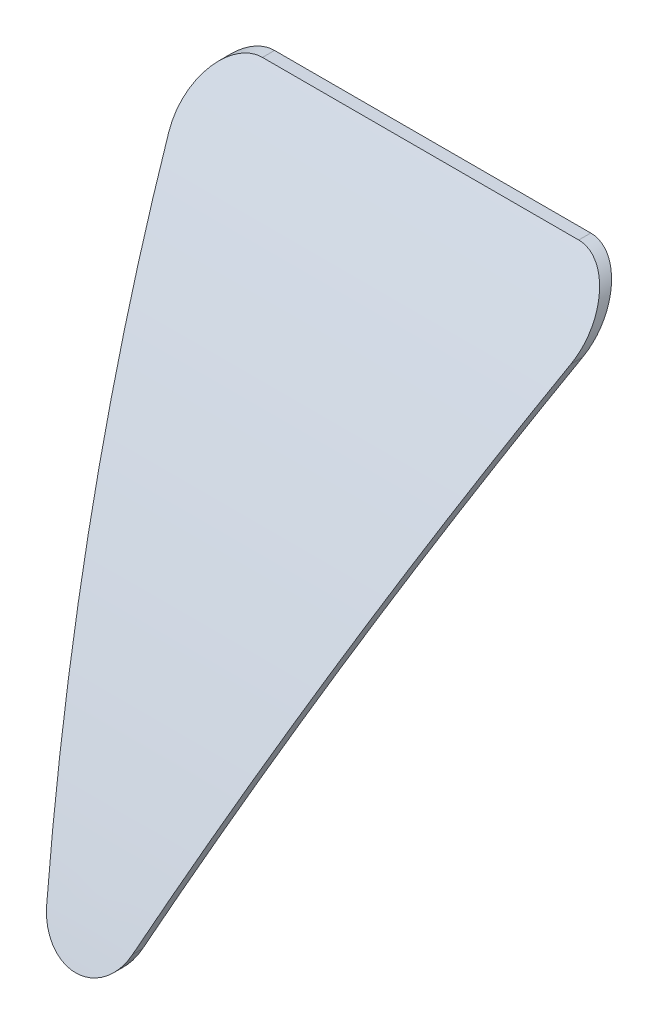
ISO-10303-21;
HEADER;
FILE_DESCRIPTION(('STEP AP214'),'2;1');
FILE_NAME('part.step','',(''),(''),'','','');
FILE_SCHEMA(('AUTOMOTIVE_DESIGN { 1 0 10303 214 1 1 1 1 }'));
ENDSEC;
DATA;
#1=APPLICATION_CONTEXT('core data for automotive mechanical design processes');
#2=APPLICATION_PROTOCOL_DEFINITION('international standard','automotive_design',2000,#1);
#3=PRODUCT_CONTEXT('',#1,'mechanical');
#4=PRODUCT('Part','Part','',(#3));
#5=PRODUCT_RELATED_PRODUCT_CATEGORY('part','',(#4));
#6=PRODUCT_DEFINITION_FORMATION('','',#4);
#7=PRODUCT_DEFINITION_CONTEXT('part definition',#1,'design');
#8=PRODUCT_DEFINITION('design','',#6,#7);
#9=PRODUCT_DEFINITION_SHAPE('','',#8);
#10=(LENGTH_UNIT() NAMED_UNIT(*) SI_UNIT(.MILLI.,.METRE.));
#11=(NAMED_UNIT(*) PLANE_ANGLE_UNIT() SI_UNIT($,.RADIAN.));
#12=(NAMED_UNIT(*) SI_UNIT($,.STERADIAN.) SOLID_ANGLE_UNIT());
#13=UNCERTAINTY_MEASURE_WITH_UNIT(LENGTH_MEASURE(1.E-05),#10,'distance_accuracy_value','');
#14=(GEOMETRIC_REPRESENTATION_CONTEXT(3) GLOBAL_UNCERTAINTY_ASSIGNED_CONTEXT((#13)) GLOBAL_UNIT_ASSIGNED_CONTEXT((#10,
#11,#12)) REPRESENTATION_CONTEXT('',''));
#15=CARTESIAN_POINT('',(0.,0.,0.));
#16=DIRECTION('',(0.,0.,1.));
#17=DIRECTION('',(1.,0.,0.));
#18=AXIS2_PLACEMENT_3D('',#15,#16,#17);
#19=CARTESIAN_POINT('',(-60.,46.1238875984716,901.187247090794));
#20=CARTESIAN_POINT('',(-60.,43.9205322893696,904.174214990212));
#21=CARTESIAN_POINT('',(-60.,39.4331434562208,910.057300325134));
#22=CARTESIAN_POINT('',(-60.,29.9691555350318,921.699273064818));
#23=CARTESIAN_POINT('',(-60.,17.3414276134693,935.882033544309));
#24=CARTESIAN_POINT('',(-60.,0.994833195672746,952.277254345218));
#25=CARTESIAN_POINT('',(-60.,-22.2362803954615,973.200532651199));
#26=CARTESIAN_POINT('',(-60.,-53.6981260838877,997.430635359544));
#27=CARTESIAN_POINT('',(-60.,-94.4552893482323,1022.87008493301));
#28=CARTESIAN_POINT('',(-60.,-137.345060056551,1044.11379481753));
#29=CARTESIAN_POINT('',(-60.,-174.140029416856,1057.85164783235));
#30=CARTESIAN_POINT('',(-60.,-203.773435023607,1066.1795804891));
#31=CARTESIAN_POINT('',(-60.,-225.991713010942,1071.02316435922));
#32=CARTESIAN_POINT('',(-60.,-244.401641403054,1073.83070593098));
#33=CARTESIAN_POINT('',(-60.,-259.033452953445,1075.30437859251));
#34=CARTESIAN_POINT('',(-60.,-266.272162058962,1075.77602359509));
#35=CARTESIAN_POINT('',(-60.,-269.906707002997,1075.9457471413));
#36=B_SPLINE_CURVE_WITH_KNOTS('',3,(#19,#20,#21,#22,#23,#24,#25,#26,#27,#28,#29,#30,#31,#32,#33,
#34,#35),.UNSPECIFIED.,.F.,.F.,(4,1,1,1,1,1,1,1,1,1,1,1,1,1,4),(0.509799213808205,
0.525117988376698,0.540436762945192,0.571074312082179,0.601711861219166,0.632349410356153,
0.693624508630128,0.754899606904102,0.816174705178077,0.877449803452051,0.908087352589038,
0.938724901726026,0.969362450863013,0.984681225431506,1.),.UNSPECIFIED.);
#37=DIRECTION('',(1.,0.,0.));
#38=VECTOR('',#37,1.);
#39=SURFACE_OF_LINEAR_EXTRUSION('',#36,#38);
#40=CARTESIAN_POINT('',(-44.1873537032663,-27.0898308059692,976.550937195371));
#41=CARTESIAN_POINT('',(-44.2990245787174,-26.7717037852785,976.294854801287));
#42=CARTESIAN_POINT('',(-44.3938194796412,-26.450404613736,976.035519422809));
#43=CARTESIAN_POINT('',(-44.5502031828139,-25.803768092434,975.512152721648));
#44=CARTESIAN_POINT('',(-44.611804576093,-25.4784323218202,975.248123218864));
#45=CARTESIAN_POINT('',(-44.7025323454115,-24.8250541562334,974.716387403333));
#46=CARTESIAN_POINT('',(-44.7315857914468,-24.4970073355271,974.448674188706));
#47=CARTESIAN_POINT('',(-44.7573486708419,-23.8408493294559,973.911694700706));
#48=CARTESIAN_POINT('',(-44.7540532432889,-23.5127381418263,973.642428200003));
#49=CARTESIAN_POINT('',(-44.7138234574,-22.8333239016014,973.083302805992));
#50=CARTESIAN_POINT('',(-44.6743333302229,-22.4821682272866,972.793445452658));
#51=CARTESIAN_POINT('',(-44.5580764807993,-21.7843542860032,972.215724128079));
#52=CARTESIAN_POINT('',(-44.4813065834287,-21.4376964046949,971.927860328744));
#53=CARTESIAN_POINT('',(-44.2902666275179,-20.7515167924368,971.356386036762));
#54=CARTESIAN_POINT('',(-44.1760131568869,-20.4119919754257,971.072773720623));
#55=CARTESIAN_POINT('',(-43.9094941701429,-19.7426604700549,970.512066045544));
#56=CARTESIAN_POINT('',(-43.7572382251866,-19.4128513580834,970.234969064877));
#57=CARTESIAN_POINT('',(-43.4506266739687,-18.8350130614005,969.748144116766));
#58=CARTESIAN_POINT('',(-43.3036432723648,-18.5845430251286,969.536651247892));
#59=CARTESIAN_POINT('',(-42.9852865741202,-18.0932143124026,969.120909479095));
#60=CARTESIAN_POINT('',(-42.8139142268037,-17.8523552623138,968.916660297602));
#61=CARTESIAN_POINT('',(-42.4465811882176,-17.3825232891132,968.517441875774));
#62=CARTESIAN_POINT('',(-42.2506476644509,-17.1535376222959,968.322462705434));
#63=CARTESIAN_POINT('',(-41.8337516494048,-16.7095517066187,967.943698506984));
#64=CARTESIAN_POINT('',(-41.6127972035921,-16.4945469969974,967.759909909615));
#65=CARTESIAN_POINT('',(-41.1988218488657,-16.1282006992949,967.446205680429));
#66=CARTESIAN_POINT('',(-41.0108564965139,-15.9734916790282,967.313535786012));
#67=CARTESIAN_POINT('',(-40.6199980008349,-15.675477188786,967.057652301276));
#68=CARTESIAN_POINT('',(-40.417105825063,-15.5321709809325,966.934438099097));
#69=CARTESIAN_POINT('',(-39.996855927001,-15.2586619477894,966.69900516216));
#70=CARTESIAN_POINT('',(-39.7795087006929,-15.1284497836707,966.586778592421));
#71=CARTESIAN_POINT('',(-39.3308356495707,-14.8827615146948,966.374809487455));
#72=CARTESIAN_POINT('',(-39.099512420939,-14.7672826852993,966.275064644131));
#73=CARTESIAN_POINT('',(-38.6635934198861,-14.5707786859862,966.105185249658));
#74=CARTESIAN_POINT('',(-38.4609800758951,-14.4872199004033,966.032887164373));
#75=CARTESIAN_POINT('',(-38.0475834479023,-14.3326572186193,965.899069676851));
#76=CARTESIAN_POINT('',(-37.8368016644231,-14.2616510297406,965.837548306311));
#77=CARTESIAN_POINT('',(-37.4084395889681,-14.1332990830572,965.726284521339));
#78=CARTESIAN_POINT('',(-37.1908702200397,-14.0759325406108,965.676524185664));
#79=CARTESIAN_POINT('',(-36.7500601435882,-13.9756490777534,965.589503999959));
#80=CARTESIAN_POINT('',(-36.5268214113484,-13.9327271969354,965.552239858657));
#81=CARTESIAN_POINT('',(-36.0469186286777,-13.8574752022164,965.486891230227));
#82=CARTESIAN_POINT('',(-35.7896671965984,-13.8272342419064,965.460618450042));
#83=CARTESIAN_POINT('',(-35.4017699451396,-13.7969203472494,965.434279740603));
#84=CARTESIAN_POINT('',(-35.2720838593374,-13.7893236163793,965.427678559421));
#85=CARTESIAN_POINT('',(-35.0123286017673,-13.7791838663551,965.418867272819));
#86=CARTESIAN_POINT('',(-34.882259331466,-13.7766422862873,965.416658417795));
#87=CARTESIAN_POINT('',(-34.7521645347319,-13.7766442199206,965.416660254602));
#88=B_SPLINE_CURVE_WITH_KNOTS('',3,(#40,#41,#42,#43,#44,#45,#46,#47,#48,#49,#50,#51,#52,#53,#54,
#55,#56,#57,#58,#59,#60,#61,#62,#63,#64,#65,#66,#67,#68,#69,#70,#71,#72,#73,#74,#75,#76,#77,#78,
#79,#80,#81,#82,#83,#84,#85,#86,#87),.UNSPECIFIED.,.F.,.F.,(4,2,2,2,2,2,2,2,2,2,2,2,2,2,2,2,2,2,
2,2,2,2,2,4),(0.,1.26964437677288,2.53880680977324,3.81080739523819,5.08299912116088,
6.45257787524256,7.82227329703211,9.19136339219926,10.5601090209375,11.6369588814204,
12.7137668376621,13.7893940592801,14.8646763903039,15.6957076591424,16.5266851079864,
17.3570656264922,18.187292364954,18.8789609827986,19.5705031395382,20.2609846440225,
20.951228789352,21.7307866949914,22.1208661217231,22.5110565792891),.UNSPECIFIED.);
#89=CARTESIAN_POINT('',(-44.1873537032663,-27.0898308059692,976.550937195371));
#90=VERTEX_POINT('',#89);
#91=CARTESIAN_POINT('',(-34.7521645347319,-13.7766442199206,965.416660254602));
#92=VERTEX_POINT('',#91);
#93=EDGE_CURVE('E12',#90,#92,#88,.T.);
#94=ORIENTED_EDGE('',*,*,#93,.F.);
#95=CARTESIAN_POINT('',(-9.43518916853449,-126.055958395028,1038.14997567389));
#96=CARTESIAN_POINT('',(-10.4659238863039,-123.120664293065,1036.78233498408));
#97=CARTESIAN_POINT('',(-11.4921676589707,-120.19815936415,1035.38389089442));
#98=CARTESIAN_POINT('',(-13.533424170732,-114.385132892574,1032.52913474921));
#99=CARTESIAN_POINT('',(-14.5484544847671,-111.494561300547,1031.07293718095));
#100=CARTESIAN_POINT('',(-16.5674153466973,-105.745027683456,1028.10346859922));
#101=CARTESIAN_POINT('',(-17.5713603140013,-102.886024595251,1026.59028688147));
#102=CARTESIAN_POINT('',(-19.5682433409742,-97.1993635462591,1023.50739256382));
#103=CARTESIAN_POINT('',(-20.5611925689469,-94.3716737807254,1021.93774586134));
#104=CARTESIAN_POINT('',(-22.5361418535293,-88.7474749575251,1018.74226076883));
#105=CARTESIAN_POINT('',(-23.518149673124,-85.9509437926726,1017.11646608509));
#106=CARTESIAN_POINT('',(-25.4712379334089,-80.3890001109525,1013.80880864563));
#107=CARTESIAN_POINT('',(-26.4423225131416,-77.623575807049,1012.1269681546));
#108=CARTESIAN_POINT('',(-28.373610162655,-72.1237152230588,1008.70703635671));
#109=CARTESIAN_POINT('',(-29.3338127931398,-69.3892801939849,1006.96894278978));
#110=CARTESIAN_POINT('',(-31.2432410342089,-63.9516701498986,1003.43629069061));
#111=CARTESIAN_POINT('',(-32.1924624196797,-61.2485071670325,1001.64171135246));
#112=CARTESIAN_POINT('',(-34.0798255460449,-55.8737334667045,997.995619823904));
#113=CARTESIAN_POINT('',(-35.0179584923661,-53.2021477941534,996.14406615639));
#114=CARTESIAN_POINT('',(-36.8829955899081,-47.8909534606553,992.383348443962));
#115=CARTESIAN_POINT('',(-37.8098858716627,-45.2513842967401,990.474121731514));
#116=CARTESIAN_POINT('',(-39.65224403748,-40.0047743159202,986.597167807364));
#117=CARTESIAN_POINT('',(-40.5676923343617,-37.397789278777,984.629355776616));
#118=CARTESIAN_POINT('',(-42.3869091877876,-32.2170804038412,980.634086705723));
#119=CARTESIAN_POINT('',(-43.2906515927463,-29.6434310397161,978.606521198148));
#120=CARTESIAN_POINT('',(-44.1873537032663,-27.0898308059692,976.550937195371));
#121=B_SPLINE_CURVE_WITH_KNOTS('',3,(#95,#96,#97,#98,#99,#100,#101,#102,#103,#104,#105,#106,
#107,#108,#109,#110,#111,#112,#113,#114,#115,#116,#117,#118,#119,#120),.UNSPECIFIED.,.F.,.F.,(4,
2,2,2,2,2,2,2,2,2,2,2,4),(0.,10.1948760155067,20.3704641125022,30.5307210850215,
40.6794825053297,50.8205145848819,60.9575649806157,71.0950231538619,81.236260078873,
91.3850630982889,101.545321358887,111.721082872411,121.916617095784),.UNSPECIFIED.);
#122=CARTESIAN_POINT('',(-9.43518916853449,-126.055958395028,1038.14997567389));
#123=VERTEX_POINT('',#122);
#124=EDGE_CURVE('E89',#123,#90,#121,.T.);
#125=ORIENTED_EDGE('',*,*,#124,.F.);
#126=CARTESIAN_POINT('',(9.43518916853451,-126.055958395028,1038.14997567389));
#127=CARTESIAN_POINT('',(9.34070440688362,-126.325081889111,1038.27536852229));
#128=CARTESIAN_POINT('',(9.23439141303715,-126.590950708033,1038.39893008414));
#129=CARTESIAN_POINT('',(8.99842035456894,-127.114360241968,1038.64160883571));
#130=CARTESIAN_POINT('',(8.86875328905063,-127.371897700686,1038.76072429042));
#131=CARTESIAN_POINT('',(8.58594195759699,-127.877539356138,1038.99405748316));
#132=CARTESIAN_POINT('',(8.43271342863692,-128.125605540364,1039.10825568111));
#133=CARTESIAN_POINT('',(8.10370872319548,-128.609237718899,1039.33041137345));
#134=CARTESIAN_POINT('',(7.92793523844803,-128.844805200741,1039.43836961062));
#135=CARTESIAN_POINT('',(7.5540399062797,-129.302035598428,1039.6474827515));
#136=CARTESIAN_POINT('',(7.35585535730427,-129.523656660971,1039.74861723706));
#137=CARTESIAN_POINT('',(6.93856358634254,-129.950081517607,1039.94283961839));
#138=CARTESIAN_POINT('',(6.71945814631573,-130.154886741249,1040.0359281982));
#139=CARTESIAN_POINT('',(6.26194293884508,-130.545229696676,1040.21303890263));
#140=CARTESIAN_POINT('',(6.02356381845697,-130.730796986487,1040.29707494398));
#141=CARTESIAN_POINT('',(5.52879208530429,-131.080893546071,1040.45537454564));
#142=CARTESIAN_POINT('',(5.27240122450054,-131.245424857588,1040.52963905439));
#143=CARTESIAN_POINT('',(4.76296383377514,-131.540175137837,1040.66250306832));
#144=CARTESIAN_POINT('',(4.51105705026072,-131.672027362189,1040.7218528204));
#145=CARTESIAN_POINT('',(3.99518342297765,-131.914451950166,1040.83085982343));
#146=CARTESIAN_POINT('',(3.73121705100882,-132.025025145395,1040.88051745317));
#147=CARTESIAN_POINT('',(3.19325443540779,-132.223559127902,1040.96960341928));
#148=CARTESIAN_POINT('',(2.91925880293169,-132.311521290422,1041.00903237778));
#149=CARTESIAN_POINT('',(2.36346419889733,-132.463730404341,1041.07721844618));
#150=CARTESIAN_POINT('',(2.0816657588297,-132.527978966748,1041.10597628104));
#151=CARTESIAN_POINT('',(1.53582550653376,-132.627702075128,1041.15059572097));
#152=CARTESIAN_POINT('',(1.27220164917509,-132.665090611517,1041.16731540682));
#153=CARTESIAN_POINT('',(0.742392434043492,-132.718729582099,1041.19129837297));
#154=CARTESIAN_POINT('',(0.476207236126989,-132.734981326954,1041.19856223961));
#155=CARTESIAN_POINT('',(-0.0566099037791517,-132.746160258656,1041.2035590046));
#156=CARTESIAN_POINT('',(-0.323241668910413,-132.741094496078,1041.20129505419));
#157=CARTESIAN_POINT('',(-0.854999557841949,-132.709712646605,1041.18726662933));
#158=CARTESIAN_POINT('',(-1.12012569404236,-132.683396734978,1041.17550223324));
#159=CARTESIAN_POINT('',(-1.63768920478828,-132.611097940875,1041.1431668834));
#160=CARTESIAN_POINT('',(-1.89024713030431,-132.565831113141,1041.12291654408));
#161=CARTESIAN_POINT('',(-2.39034114844659,-132.456256825347,1041.0738680253));
#162=CARTESIAN_POINT('',(-2.63787740133731,-132.391949973964,1041.04507011911));
#163=CARTESIAN_POINT('',(-3.12629523473333,-132.244946437512,1040.9791873659));
#164=CARTESIAN_POINT('',(-3.36717667172203,-132.162249356189,1040.94210234032));
#165=CARTESIAN_POINT('',(-3.84076286576518,-131.979274740537,1040.85997053116));
#166=CARTESIAN_POINT('',(-4.07346742766492,-131.878996786953,1040.8149235577));
#167=CARTESIAN_POINT('',(-4.53413723273113,-131.65950145098,1040.71621262586));
#168=CARTESIAN_POINT('',(-4.7618981599806,-131.539928371035,1040.66238657552));
#169=CARTESIAN_POINT('',(-5.20613764659254,-131.284538574485,1040.54727498477));
#170=CARTESIAN_POINT('',(-5.42261608086057,-131.148721677834,1040.48598936168));
#171=CARTESIAN_POINT('',(-5.84315257143845,-130.862028646034,1040.356438948));
#172=CARTESIAN_POINT('',(-6.04721032489617,-130.711152143925,1040.28817398735));
#173=CARTESIAN_POINT('',(-6.44200478690863,-130.395515182305,1040.14514110772));
#174=CARTESIAN_POINT('',(-6.63273556468925,-130.230748612499,1040.07037032634));
#175=CARTESIAN_POINT('',(-7.01207469325924,-129.877360662664,1039.90973676436));
#176=CARTESIAN_POINT('',(-7.19971327445409,-129.687882676104,1039.82346766426));
#177=CARTESIAN_POINT('',(-7.55792415548693,-129.296258553783,1039.64482432702));
#178=CARTESIAN_POINT('',(-7.72850203777549,-129.094116597258,1039.55245210344));
#179=CARTESIAN_POINT('',(-8.05203646987792,-128.678599372767,1039.36219642651));
#180=CARTESIAN_POINT('',(-8.20499068513888,-128.465222622005,1039.26431224556));
#181=CARTESIAN_POINT('',(-8.49270767069041,-128.028811792461,1039.0636984464));
#182=CARTESIAN_POINT('',(-8.62747498637345,-127.805780145168,1038.96097004757));
#183=CARTESIAN_POINT('',(-8.88867555258189,-127.332996661875,1038.74273825072));
#184=CARTESIAN_POINT('',(-9.0135431383771,-127.082545805039,1038.62687490266));
#185=CARTESIAN_POINT('',(-9.24100210135219,-126.574385586155,1038.39123105066));
#186=CARTESIAN_POINT('',(-9.34364850428319,-126.316695981158,1038.27146108778));
#187=CARTESIAN_POINT('',(-9.43518916853452,-126.055958395028,1038.14997567389));
#188=B_SPLINE_CURVE_WITH_KNOTS('',3,(#126,#127,#128,#129,#130,#131,#132,#133,#134,#135,#136,
#137,#138,#139,#140,#141,#142,#143,#144,#145,#146,#147,#148,#149,#150,#151,#152,#153,#154,#155,
#156,#157,#158,#159,#160,#161,#162,#163,#164,#165,#166,#167,#168,#169,#170,#171,#172,#173,#174,
#175,#176,#177,#178,#179,#180,#181,#182,#183,#184,#185,#186,#187),.UNSPECIFIED.,.F.,.F.,(4,2,2,
2,2,2,2,2,2,2,2,2,2,2,2,2,2,2,2,2,2,2,2,2,2,2,2,2,2,2,4),(0.,0.934534173519101,1.86942929976405,
2.80774918990191,3.74595715431715,4.68685819688683,5.6276791685634,6.56703250235869,
7.50629459357173,8.37650814552602,9.24668768175884,10.1168142795869,10.9868817535728,
11.7862447372053,12.5855581510819,13.3846072199028,14.1836496983054,14.9548938784082,
15.7261134057461,16.4973495521074,17.2686040928156,18.0561698916737,18.843744420796,
19.6313381455767,20.4192801621789,21.2591936153322,22.0988313341072,22.9385801495446,
23.7781186990685,24.6858377356866,25.5912826260444),.UNSPECIFIED.);
#189=CARTESIAN_POINT('',(9.4351891685345,-126.055958395028,1038.14997567389));
#190=VERTEX_POINT('',#189);
#191=EDGE_CURVE('E94',#190,#123,#188,.T.);
#192=ORIENTED_EDGE('',*,*,#191,.F.);
#193=CARTESIAN_POINT('',(9.43518916853449,-126.055958395028,1038.14997567389));
#194=CARTESIAN_POINT('',(10.4659238863039,-123.120664293065,1036.78233498408));
#195=CARTESIAN_POINT('',(11.4921676589707,-120.19815936415,1035.38389089442));
#196=CARTESIAN_POINT('',(13.533424170732,-114.385132892574,1032.52913474921));
#197=CARTESIAN_POINT('',(14.5484544847671,-111.494561300547,1031.07293718095));
#198=CARTESIAN_POINT('',(16.5674153466973,-105.745027683456,1028.10346859922));
#199=CARTESIAN_POINT('',(17.5713603140013,-102.886024595251,1026.59028688147));
#200=CARTESIAN_POINT('',(19.5682433409742,-97.1993635462591,1023.50739256382));
#201=CARTESIAN_POINT('',(20.5611925689469,-94.3716737807253,1021.93774586134));
#202=CARTESIAN_POINT('',(22.5361418535293,-88.7474749575251,1018.74226076883));
#203=CARTESIAN_POINT('',(23.518149673124,-85.9509437926726,1017.11646608509));
#204=CARTESIAN_POINT('',(25.4712379334089,-80.3890001109525,1013.80880864563));
#205=CARTESIAN_POINT('',(26.4423225131416,-77.623575807049,1012.1269681546));
#206=CARTESIAN_POINT('',(28.373610162655,-72.1237152230588,1008.70703635671));
#207=CARTESIAN_POINT('',(29.3338127931398,-69.3892801939849,1006.96894278978));
#208=CARTESIAN_POINT('',(31.2432410342089,-63.9516701498986,1003.43629069061));
#209=CARTESIAN_POINT('',(32.1924624196797,-61.2485071670325,1001.64171135246));
#210=CARTESIAN_POINT('',(34.0798255460449,-55.8737334667045,997.995619823904));
#211=CARTESIAN_POINT('',(35.0179584923661,-53.2021477941534,996.14406615639));
#212=CARTESIAN_POINT('',(36.8829955899081,-47.8909534606553,992.383348443962));
#213=CARTESIAN_POINT('',(37.8098858716627,-45.2513842967401,990.474121731514));
#214=CARTESIAN_POINT('',(39.65224403748,-40.0047743159202,986.597167807364));
#215=CARTESIAN_POINT('',(40.5676923343617,-37.397789278777,984.629355776616));
#216=CARTESIAN_POINT('',(42.3869091877876,-32.2170804038412,980.634086705723));
#217=CARTESIAN_POINT('',(43.2906515927463,-29.6434310397161,978.606521198148));
#218=CARTESIAN_POINT('',(44.1873537032663,-27.0898308059692,976.550937195371));
#219=B_SPLINE_CURVE_WITH_KNOTS('',3,(#193,#194,#195,#196,#197,#198,#199,#200,#201,#202,#203,
#204,#205,#206,#207,#208,#209,#210,#211,#212,#213,#214,#215,#216,#217,#218),.UNSPECIFIED.,.F.,
.F.,(4,2,2,2,2,2,2,2,2,2,2,2,4),(0.,10.1948760155067,20.3704641125022,30.5307210850215,
40.6794825053297,50.8205145848819,60.9575649806157,71.0950231538619,81.236260078873,
91.3850630982889,101.545321358887,111.721082872411,121.916617095784),.UNSPECIFIED.);
#220=CARTESIAN_POINT('',(44.1873537032663,-27.0898308059692,976.550937195371));
#221=VERTEX_POINT('',#220);
#222=EDGE_CURVE('E111',#190,#221,#219,.T.);
#223=ORIENTED_EDGE('',*,*,#222,.T.);
#224=CARTESIAN_POINT('',(34.7521645347319,-13.7766442199206,965.416660254602));
#225=CARTESIAN_POINT('',(34.8689554418214,-13.7766427892559,965.416658908237));
#226=CARTESIAN_POINT('',(34.9857290661078,-13.7786907950522,965.418438777339));
#227=CARTESIAN_POINT('',(35.2190194086583,-13.7868660912366,965.425543037887));
#228=CARTESIAN_POINT('',(35.3355361400923,-13.7929931673884,965.430867243183));
#229=CARTESIAN_POINT('',(35.6841788513618,-13.8174494199488,965.452117163366));
#230=CARTESIAN_POINT('',(35.9156060924242,-13.8418536937274,965.473320249186));
#231=CARTESIAN_POINT('',(36.3728305520216,-13.9061640477968,965.529174910841));
#232=CARTESIAN_POINT('',(36.5986567229869,-13.9459543424878,965.563726035934));
#233=CARTESIAN_POINT('',(37.0448431466716,-14.0403398190275,965.645644026099));
#234=CARTESIAN_POINT('',(37.265202767273,-14.0949367043886,965.693012365802));
#235=CARTESIAN_POINT('',(37.6984300986183,-14.2178735099055,965.799607658388));
#236=CARTESIAN_POINT('',(37.9113159091258,-14.2861770848454,965.858803247885));
#237=CARTESIAN_POINT('',(38.3291551233591,-14.4356379269916,965.988240995435));
#238=CARTESIAN_POINT('',(38.5341049911771,-14.5168008435852,966.058488008523));
#239=CARTESIAN_POINT('',(38.9353981712714,-14.6910248933242,966.20915599967));
#240=CARTESIAN_POINT('',(39.1317280627232,-14.7841037541772,966.289592134478));
#241=CARTESIAN_POINT('',(39.514837217529,-14.9809999251382,966.459588335444));
#242=CARTESIAN_POINT('',(39.7016144660563,-15.0848194868117,966.549150314586));
#243=CARTESIAN_POINT('',(40.1285804473986,-15.3400732512684,966.769129386769));
#244=CARTESIAN_POINT('',(40.3646777506554,-15.4954853242675,966.902901132383));
#245=CARTESIAN_POINT('',(40.8180332262939,-15.8215659882369,967.183155057592));
#246=CARTESIAN_POINT('',(41.035286044793,-15.9922388871531,967.329640825858));
#247=CARTESIAN_POINT('',(41.4509663820893,-16.3469223680932,967.633568068974));
#248=CARTESIAN_POINT('',(41.6493700817754,-16.5309493208983,967.791022981157));
#249=CARTESIAN_POINT('',(42.0270104407655,-16.9101827416978,968.114945653603));
#250=CARTESIAN_POINT('',(42.2062464963904,-17.1053895615015,968.281413697484));
#251=CARTESIAN_POINT('',(42.8140762895899,-17.8215229147356,968.891011581552));
#252=CARTESIAN_POINT('',(43.1896788134769,-18.3702024923354,969.356064735611));
#253=CARTESIAN_POINT('',(43.6612814958959,-19.2232182970271,970.075361328593));
#254=CARTESIAN_POINT('',(43.803268458348,-19.5128302605711,970.318975194501));
#255=CARTESIAN_POINT('',(44.0573867834287,-20.1003517895277,970.811914714226));
#256=CARTESIAN_POINT('',(44.1695206160923,-20.398260666203,971.061239893636));
#257=CARTESIAN_POINT('',(44.3657689730791,-21.0050223278728,971.567718880756));
#258=CARTESIAN_POINT('',(44.4494186409274,-21.3139733630691,971.824934139972));
#259=CARTESIAN_POINT('',(44.5865507526997,-21.9364060309042,972.341746821135));
#260=CARTESIAN_POINT('',(44.6400311211378,-22.2498879737241,972.601344405724));
#261=CARTESIAN_POINT('',(44.7552611306474,-23.1940461129737,973.381084742144));
#262=CARTESIAN_POINT('',(44.7721623172684,-23.8295708933424,973.903123865854));
#263=CARTESIAN_POINT('',(44.7133500598847,-24.6844025893084,974.601531723556));
#264=CARTESIAN_POINT('',(44.6907478893232,-24.905436731147,974.781776816383));
#265=CARTESIAN_POINT('',(44.6306596937454,-25.3466290618267,975.140883132812));
#266=CARTESIAN_POINT('',(44.5931765666359,-25.5667874127926,975.319744618947));
#267=CARTESIAN_POINT('',(44.5031989808013,-26.0054206322913,975.675440606508));
#268=CARTESIAN_POINT('',(44.450714014527,-26.223896475945,975.852276316389));
#269=CARTESIAN_POINT('',(44.3305103210313,-26.6586798032903,976.203551912954));
#270=CARTESIAN_POINT('',(44.2627870563087,-26.8749866210308,976.377991069568));
#271=CARTESIAN_POINT('',(44.1873537032663,-27.0898308059692,976.550937195371));
#272=B_SPLINE_CURVE_WITH_KNOTS('',3,(#224,#225,#226,#227,#228,#229,#230,#231,#232,#233,#234,
#235,#236,#237,#238,#239,#240,#241,#242,#243,#244,#245,#246,#247,#248,#249,#250,#251,#252,#253,
#254,#255,#256,#257,#258,#259,#260,#261,#262,#263,#264,#265,#266,#267,#268,#269,#270,#271),
.UNSPECIFIED.,.F.,.F.,(4,2,2,2,2,2,2,2,2,2,2,2,2,2,2,2,2,2,2,2,2,2,2,4),(0.,0.350307048297176,
0.700595699614665,1.40054919408402,2.09533468844582,2.7902001524818,3.48324686747172,
4.1765989014796,4.87099471158535,5.56553638349616,6.50231401047295,7.43935691831856,
8.37756861536541,9.3158098524005,11.7350844506505,12.9469030639968,14.1586213808206,
15.389260432439,16.6199841350974,19.0769002107706,19.9349940822027,20.7929209309474,
21.6503061215531,22.5079469540188),.UNSPECIFIED.);
#273=CARTESIAN_POINT('',(34.7521645347319,-13.7766442199206,965.416660254602));
#274=VERTEX_POINT('',#273);
#275=EDGE_CURVE('E107',#274,#221,#272,.T.);
#276=ORIENTED_EDGE('',*,*,#275,.F.);
#277=DIRECTION('',(1.,0.,0.));
#278=VECTOR('',#277,1.);
#279=CARTESIAN_POINT('',(-60.,-13.7766442199207,965.416660254602));
#280=LINE('',#279,#278);
#281=EDGE_CURVE('E48',#92,#274,#280,.T.);
#282=ORIENTED_EDGE('',*,*,#281,.F.);
#283=EDGE_LOOP('',(#94,#125,#192,#223,#276,#282));
#284=FACE_BOUND('',#283,.T.);
#285=ADVANCED_FACE('F34',(#284),#39,.T.);
#286=CARTESIAN_POINT('',(-34.752164534732,-23.7766442199207,1059.12223828106));
#287=DIRECTION('',(0.,0.,-1.));
#288=DIRECTION('',(-1.,0.,0.));
#289=AXIS2_PLACEMENT_3D('',#286,#287,#288);
#290=CYLINDRICAL_SURFACE('',#289,10.);
#291=DIRECTION('',(0.,0.,-1.));
#292=VECTOR('',#291,1.);
#293=CARTESIAN_POINT('',(-44.1873537032663,-27.0898308059692,1059.12223828106));
#294=LINE('',#293,#292);
#295=CARTESIAN_POINT('',(-44.1873537032663,-27.0898308059692,973.979870350138));
#296=VERTEX_POINT('',#295);
#297=EDGE_CURVE('E55',#90,#296,#294,.T.);
#298=ORIENTED_EDGE('',*,*,#297,.F.);
#299=ORIENTED_EDGE('',*,*,#93,.T.);
#300=DIRECTION('',(0.,0.,-1.));
#301=VECTOR('',#300,1.);
#302=CARTESIAN_POINT('',(-34.7521645347319,-13.7766442199206,1059.12223828106));
#303=LINE('',#302,#301);
#304=CARTESIAN_POINT('',(-34.7521645347319,-13.7766442199206,962.762517937667));
#305=VERTEX_POINT('',#304);
#306=EDGE_CURVE('E191',#92,#305,#303,.T.);
#307=ORIENTED_EDGE('',*,*,#306,.T.);
#308=CARTESIAN_POINT('',(-44.1873537032663,-27.0898308059692,973.979870350138));
#309=CARTESIAN_POINT('',(-44.2987115861936,-26.7725936089851,973.722687353044));
#310=CARTESIAN_POINT('',(-44.393280797004,-26.452226123633,973.462260475148));
#311=CARTESIAN_POINT('',(-44.5493958206888,-25.8075094332875,972.936719777434));
#312=CARTESIAN_POINT('',(-44.6109542693771,-25.4831618005084,972.671607791171));
#313=CARTESIAN_POINT('',(-44.701788881083,-24.8317804820485,972.13769409198));
#314=CARTESIAN_POINT('',(-44.7309916092667,-24.5047423764473,971.868885381932));
#315=CARTESIAN_POINT('',(-44.7572486704513,-23.8506013905481,971.329699701277));
#316=CARTESIAN_POINT('',(-44.754298047144,-23.5234985080361,971.059322495312));
#317=CARTESIAN_POINT('',(-44.7148771553361,-22.8441902654973,970.4962389128));
#318=CARTESIAN_POINT('',(-44.6756598521291,-22.4921418225091,970.203531813549));
#319=CARTESIAN_POINT('',(-44.5597660948691,-21.7925359016117,969.620095506392));
#320=CARTESIAN_POINT('',(-44.4830862881061,-21.4449788285163,969.329366477876));
#321=CARTESIAN_POINT('',(-44.2920348833335,-20.7569946534512,968.752163298673));
#322=CARTESIAN_POINT('',(-44.1776795350085,-20.4165645447851,968.465687369172));
#323=CARTESIAN_POINT('',(-43.910748002768,-19.7454260295385,967.899279777855));
#324=CARTESIAN_POINT('',(-43.7581815857521,-19.4147151627803,967.619346463681));
#325=CARTESIAN_POINT('',(-43.4511516127426,-18.8359351398387,967.128063361648));
#326=CARTESIAN_POINT('',(-43.3041674816499,-18.5854020463382,966.914922744093));
#327=CARTESIAN_POINT('',(-42.9857697534021,-18.0939101882414,966.495899416693));
#328=CARTESIAN_POINT('',(-42.8143570885959,-17.85295105869,966.290016430226));
#329=CARTESIAN_POINT('',(-42.4468859435538,-17.3828838106136,965.887561940001));
#330=CARTESIAN_POINT('',(-42.2508550051757,-17.1537628461969,965.690980363435));
#331=CARTESIAN_POINT('',(-41.8336804004994,-16.7094714220178,965.309058491019));
#332=CARTESIAN_POINT('',(-41.6125448880311,-16.4942964681335,965.123714575072));
#333=CARTESIAN_POINT('',(-41.1986446410327,-16.1280649288548,964.80769884562));
#334=CARTESIAN_POINT('',(-41.0109992802434,-15.9736185451739,964.67423491796));
#335=CARTESIAN_POINT('',(-40.6207812570973,-15.6760564405945,964.416770808313));
#336=CARTESIAN_POINT('',(-40.4182095563813,-15.5329399909864,964.292770017702));
#337=CARTESIAN_POINT('',(-39.9985862339372,-15.2597377768582,964.055783567509));
#338=CARTESIAN_POINT('',(-39.7815452176456,-15.1296426394342,963.942789986389));
#339=CARTESIAN_POINT('',(-39.3334527587377,-14.8841177801259,963.729320135339));
#340=CARTESIAN_POINT('',(-39.1024039481981,-14.7686853156518,963.628841524604));
#341=CARTESIAN_POINT('',(-38.6673356575673,-14.5723843238614,963.457818983336));
#342=CARTESIAN_POINT('',(-38.4653235647837,-14.4889693171031,963.385084014788));
#343=CARTESIAN_POINT('',(-38.0531207918004,-14.3346051167728,963.250398217091));
#344=CARTESIAN_POINT('',(-37.8429316271559,-14.2636536265055,963.188445401097));
#345=CARTESIAN_POINT('',(-37.4157360258778,-14.1353249164638,963.076334630302));
#346=CARTESIAN_POINT('',(-37.1987406182662,-14.0779269034452,963.0261586087));
#347=CARTESIAN_POINT('',(-36.7590497793456,-13.9774980074821,962.938331965148));
#348=CARTESIAN_POINT('',(-36.536356316073,-13.9344622342356,962.900677079803));
#349=CARTESIAN_POINT('',(-36.05540827051,-13.8585447444247,962.834235273393));
#350=CARTESIAN_POINT('',(-35.7965140197948,-13.8279064955071,962.807409018612));
#351=CARTESIAN_POINT('',(-35.4060905850842,-13.7971912633406,962.780512676584));
#352=CARTESIAN_POINT('',(-35.2755464441682,-13.7894931822513,962.773771044276));
#353=CARTESIAN_POINT('',(-35.0140652238299,-13.7792179230073,962.764772071363));
#354=CARTESIAN_POINT('',(-34.8831280424548,-13.7766422140959,962.762516017351));
#355=CARTESIAN_POINT('',(-34.7521645347318,-13.7766442199207,962.76251793767));
#356=B_SPLINE_CURVE_WITH_KNOTS('',3,(#308,#309,#310,#311,#312,#313,#314,#315,#316,#317,#318,
#319,#320,#321,#322,#323,#324,#325,#326,#327,#328,#329,#330,#331,#332,#333,#334,#335,#336,#337,
#338,#339,#340,#341,#342,#343,#344,#345,#346,#347,#348,#349,#350,#351,#352,#353,#354,#355),
.UNSPECIFIED.,.F.,.F.,(4,2,2,2,2,2,2,2,2,2,2,2,2,2,2,2,2,2,2,2,2,2,2,4),(0.,1.26939953783244,
2.53831282919445,3.81010019545001,5.08208360532682,6.45907290484545,7.83618546072122,
9.21270483565527,10.5888727252529,11.6687741981698,12.7486344661814,13.8272972195918,
14.9056106261285,15.7366989281936,16.5677337334954,17.3981659813501,18.2284426709803,
18.918787790165,19.6090055633155,20.2981574482588,20.9870744389497,21.7717683203303,
22.1644495513123,22.5572433982995),.UNSPECIFIED.);
#357=EDGE_CURVE('E95',#296,#305,#356,.T.);
#358=ORIENTED_EDGE('',*,*,#357,.F.);
#359=EDGE_LOOP('',(#298,#299,#307,#358));
#360=FACE_BOUND('',#359,.T.);
#361=ADVANCED_FACE('F98',(#360),#290,.T.);
#362=CARTESIAN_POINT('',(0.,-13.7766442199206,1059.12223828106));
#363=DIRECTION('',(0.,-1.,0.));
#364=DIRECTION('',(0.,0.,-1.));
#365=AXIS2_PLACEMENT_3D('',#362,#363,#364);
#366=PLANE('',#365);
#367=ORIENTED_EDGE('',*,*,#306,.F.);
#368=ORIENTED_EDGE('',*,*,#281,.T.);
#369=DIRECTION('',(0.,0.,-1.));
#370=VECTOR('',#369,1.);
#371=CARTESIAN_POINT('',(34.7521645347319,-13.7766442199206,1059.12223828106));
#372=LINE('',#371,#370);
#373=CARTESIAN_POINT('',(34.7521645347319,-13.7766442199206,962.762517937669));
#374=VERTEX_POINT('',#373);
#375=EDGE_CURVE('E206',#274,#374,#372,.T.);
#376=ORIENTED_EDGE('',*,*,#375,.T.);
#377=DIRECTION('',(1.,0.,0.));
#378=VECTOR('',#377,1.);
#379=CARTESIAN_POINT('',(-60.,-13.7766442199183,962.762517937667));
#380=LINE('',#379,#378);
#381=EDGE_CURVE('E144',#305,#374,#380,.T.);
#382=ORIENTED_EDGE('',*,*,#381,.F.);
#383=EDGE_LOOP('',(#367,#368,#376,#382));
#384=FACE_BOUND('',#383,.T.);
#385=ADVANCED_FACE('F130',(#384),#366,.F.);
#386=CARTESIAN_POINT('',(34.752164534732,-23.7766442199207,1059.12223828106));
#387=DIRECTION('',(0.,0.,-1.));
#388=DIRECTION('',(-1.,0.,0.));
#389=AXIS2_PLACEMENT_3D('',#386,#387,#388);
#390=CYLINDRICAL_SURFACE('',#389,10.);
#391=ORIENTED_EDGE('',*,*,#375,.F.);
#392=ORIENTED_EDGE('',*,*,#275,.T.);
#393=DIRECTION('',(0.,0.,-1.));
#394=VECTOR('',#393,1.);
#395=CARTESIAN_POINT('',(44.1873537032663,-27.0898308059692,1059.12223828106));
#396=LINE('',#395,#394);
#397=CARTESIAN_POINT('',(44.1873537032663,-27.0898308059692,973.979870350138));
#398=VERTEX_POINT('',#397);
#399=EDGE_CURVE('E203',#221,#398,#396,.T.);
#400=ORIENTED_EDGE('',*,*,#399,.T.);
#401=CARTESIAN_POINT('',(34.7521645347319,-13.7766442199206,962.762517937669));
#402=CARTESIAN_POINT('',(34.8687223752326,-13.7766427770737,962.762516569836));
#403=CARTESIAN_POINT('',(34.9852629190971,-13.7786826378135,962.76430324687));
#404=CARTESIAN_POINT('',(35.2180868704664,-13.7868252840942,962.771434557359));
#405=CARTESIAN_POINT('',(35.3343702912851,-13.7929278540776,962.776779002048));
#406=CARTESIAN_POINT('',(35.6823110071429,-13.8172858270458,962.798109285282));
#407=CARTESIAN_POINT('',(35.9132690826817,-13.8415915673656,962.81939214111));
#408=CARTESIAN_POINT('',(36.3695412598554,-13.9056360759852,962.87545139684));
#409=CARTESIAN_POINT('',(36.5948845951594,-13.945258484668,962.910126058396));
#410=CARTESIAN_POINT('',(37.0401066736222,-14.0392377135345,962.992329699516));
#411=CARTESIAN_POINT('',(37.2599847752565,-14.0935962546536,963.039860180425));
#412=CARTESIAN_POINT('',(37.69224766912,-14.2159828464514,963.146808149108));
#413=CARTESIAN_POINT('',(37.9046507942603,-14.283974247662,963.20619376467));
#414=CARTESIAN_POINT('',(38.3215361066829,-14.4327373452838,963.336033723484));
#415=CARTESIAN_POINT('',(38.5260147600424,-14.5135146637675,963.406492935791));
#416=CARTESIAN_POINT('',(38.9263874474039,-14.6868957044523,963.55760207823));
#417=CARTESIAN_POINT('',(39.1222679247306,-14.7795172609696,963.638267374067));
#418=CARTESIAN_POINT('',(39.5045050541242,-14.9754280782202,963.808731445237));
#419=CARTESIAN_POINT('',(39.6908596827094,-15.078719591506,963.8985321491));
#420=CARTESIAN_POINT('',(40.1175211789922,-15.3330391536326,964.119412686181));
#421=CARTESIAN_POINT('',(40.3537029096568,-15.4880637396558,964.253888648382));
#422=CARTESIAN_POINT('',(40.8072090160083,-15.8133301598809,964.535613621723));
#423=CARTESIAN_POINT('',(41.0245279674427,-15.983576342879,964.682866282796));
#424=CARTESIAN_POINT('',(41.4403402535567,-16.3373641180425,964.988373253775));
#425=CARTESIAN_POINT('',(41.6388095848855,-16.5209221509997,965.146641157987));
#426=CARTESIAN_POINT('',(42.0165939530374,-16.8991751632534,965.47222015905));
#427=CARTESIAN_POINT('',(42.1959083975752,-17.0938704866386,965.639531535292));
#428=CARTESIAN_POINT('',(42.8054220140289,-17.8096873972428,966.253547803577));
#429=CARTESIAN_POINT('',(43.1823239057583,-18.3586445010728,966.722394993007));
#430=CARTESIAN_POINT('',(43.6556030880326,-19.2120974761083,967.447526882144));
#431=CARTESIAN_POINT('',(43.7981043136134,-19.5018604240735,967.693113102507));
#432=CARTESIAN_POINT('',(44.053179469921,-20.0896912237904,968.190033378386));
#433=CARTESIAN_POINT('',(44.1657559114143,-20.3877583764781,968.441366949762));
#434=CARTESIAN_POINT('',(44.3628806732935,-20.9949749622724,968.952024093595));
#435=CARTESIAN_POINT('',(44.44695058939,-21.3042254616815,969.211411162463));
#436=CARTESIAN_POINT('',(44.5848500272289,-21.9272745770037,969.732584369001));
#437=CARTESIAN_POINT('',(44.6386774608739,-22.2410735054298,969.99437067106));
#438=CARTESIAN_POINT('',(44.7548478726244,-23.1862088219824,970.780682414462));
#439=CARTESIAN_POINT('',(44.7722440292125,-23.8224235182452,971.307119542352));
#440=CARTESIAN_POINT('',(44.7138958587671,-24.6785141754201,972.011646032093));
#441=CARTESIAN_POINT('',(44.6913682262003,-24.9000624180227,972.193621343012));
#442=CARTESIAN_POINT('',(44.6313589367934,-25.3422959395051,972.556179729942));
#443=CARTESIAN_POINT('',(44.5938801871009,-25.5629813777326,972.73676306966));
#444=CARTESIAN_POINT('',(44.50383660293,-26.0026826202753,973.095890596821));
#445=CARTESIAN_POINT('',(44.4512811493144,-26.2216993761388,973.274435980693));
#446=CARTESIAN_POINT('',(44.3308558769314,-26.6575744519367,973.629113167124));
#447=CARTESIAN_POINT('',(44.2629814847932,-26.8744321070571,973.805244232213));
#448=CARTESIAN_POINT('',(44.1873537032664,-27.0898308059691,973.979870350137));
#449=B_SPLINE_CURVE_WITH_KNOTS('',3,(#401,#402,#403,#404,#405,#406,#407,#408,#409,#410,#411,
#412,#413,#414,#415,#416,#417,#418,#419,#420,#421,#422,#423,#424,#425,#426,#427,#428,#429,#430,
#431,#432,#433,#434,#435,#436,#437,#438,#439,#440,#441,#442,#443,#444,#445,#446,#447,#448),
.UNSPECIFIED.,.F.,.F.,(4,2,2,2,2,2,2,2,2,2,2,2,2,2,2,2,2,2,2,2,2,2,2,4),(0.,0.34960780101174,
0.699197054163165,1.39774702873487,2.09109127893664,2.78451653513558,3.4761020515799,
4.16799251295127,4.86093732508033,5.55402872608606,6.49132357215922,7.42888706345451,
8.36762888698091,9.30639972879727,11.7345146506561,12.9507744938138,14.1669322574052,
15.4025921706958,16.6383373898543,19.1052682225908,19.9678104897013,20.8301851227502,
21.6920243379371,22.5541211908357),.UNSPECIFIED.);
#450=EDGE_CURVE('E136',#374,#398,#449,.T.);
#451=ORIENTED_EDGE('',*,*,#450,.F.);
#452=EDGE_LOOP('',(#391,#392,#400,#451));
#453=FACE_BOUND('',#452,.T.);
#454=ADVANCED_FACE('F125',(#453),#390,.T.);
#455=CARTESIAN_POINT('',(47.8052451350775,-16.7869127046764,1059.12223828106));
#456=DIRECTION('',(0.94351891685344,-0.331318658604842,0.));
#457=DIRECTION('',(0.331318658604842,0.94351891685344,0.));
#458=AXIS2_PLACEMENT_3D('',#455,#456,#457);
#459=PLANE('',#458);
#460=CARTESIAN_POINT('',(9.43518916853449,-126.055958395028,1035.94251421097));
#461=CARTESIAN_POINT('',(10.4666897515734,-123.118483285896,1034.56675065595));
#462=CARTESIAN_POINT('',(11.4936514765607,-120.193933794811,1033.1600153469));
#463=CARTESIAN_POINT('',(13.5362195535209,-114.377172288869,1030.28838853498));
#464=CARTESIAN_POINT('',(14.5518438757523,-111.484909098873,1028.82361348147));
#465=CARTESIAN_POINT('',(16.5718687793357,-105.732345337231,1025.83669951481));
#466=CARTESIAN_POINT('',(17.5762841131952,-102.872002753856,1024.31465147487));
#467=CARTESIAN_POINT('',(19.573982647841,-97.1830193276109,1021.21372373469));
#468=CARTESIAN_POINT('',(20.5672772845942,-94.3543459177519,1019.63491114645));
#469=CARTESIAN_POINT('',(22.5427905120495,-88.7285411156705,1016.42078207677));
#470=CARTESIAN_POINT('',(23.5250170602657,-85.9313870622884,1014.78551014984));
#471=CARTESIAN_POINT('',(25.4784143293292,-80.3685633950303,1011.45857590052));
#472=CARTESIAN_POINT('',(26.4495893009663,-77.6028816758877,1009.76693631513));
#473=CARTESIAN_POINT('',(28.3809317748447,-72.102864964785,1006.32705588588));
#474=CARTESIAN_POINT('',(29.3410987832973,-69.3685313790207,1004.57881251628));
#475=CARTESIAN_POINT('',(31.2503196690911,-63.931511834804,1001.02549679477));
#476=CARTESIAN_POINT('',(32.19936922604,-61.22883817983,999.220403293678));
#477=CARTESIAN_POINT('',(34.0862455330079,-55.8554508285608,995.552890512488));
#478=CARTESIAN_POINT('',(35.024063274257,-53.1847627871588,993.69042900381));
#479=CARTESIAN_POINT('',(36.8883186562227,-47.8757945988374,989.907470414296));
#480=CARTESIAN_POINT('',(37.8147420694788,-45.2375549684349,987.986909452713));
#481=CARTESIAN_POINT('',(39.6560063018617,-39.9940602570461,984.086826822632));
#482=CARTESIAN_POINT('',(40.5708270008398,-37.3888624735901,982.107218594186));
#483=CARTESIAN_POINT('',(42.3886166520761,-32.2122179404267,978.087852302553));
#484=CARTESIAN_POINT('',(43.2915586999552,-29.6408478081684,976.047983406159));
#485=CARTESIAN_POINT('',(44.1873537032663,-27.0898308059691,973.979870350138));
#486=B_SPLINE_CURVE_WITH_KNOTS('',3,(#460,#461,#462,#463,#464,#465,#466,#467,#468,#469,#470,
#471,#472,#473,#474,#475,#476,#477,#478,#479,#480,#481,#482,#483,#484,#485),.UNSPECIFIED.,.F.,
.F.,(4,2,2,2,2,2,2,2,2,2,2,2,4),(0.,10.2110482503776,20.4025549721043,30.5785218231484,
40.742829716085,50.8992920476868,61.0517060181439,71.2045736314717,81.3612639647431,
91.5256182403055,101.70158646033,111.893286162849,122.105067542749),.UNSPECIFIED.);
#487=CARTESIAN_POINT('',(9.4351891685345,-126.055958395028,1035.94251421097));
#488=VERTEX_POINT('',#487);
#489=EDGE_CURVE('E145',#488,#398,#486,.T.);
#490=ORIENTED_EDGE('',*,*,#489,.T.);
#491=ORIENTED_EDGE('',*,*,#399,.F.);
#492=ORIENTED_EDGE('',*,*,#222,.F.);
#493=DIRECTION('',(0.,0.,-1.));
#494=VECTOR('',#493,1.);
#495=CARTESIAN_POINT('',(9.4351891685345,-126.055958395028,1059.12223828106));
#496=LINE('',#495,#494);
#497=EDGE_CURVE('E205',#190,#488,#496,.T.);
#498=ORIENTED_EDGE('',*,*,#497,.T.);
#499=EDGE_LOOP('',(#490,#491,#492,#498));
#500=FACE_BOUND('',#499,.T.);
#501=ADVANCED_FACE('F129',(#500),#459,.T.);
#502=CARTESIAN_POINT('',(0.,-122.74277180898,1059.12223828106));
#503=DIRECTION('',(0.,0.,-1.));
#504=DIRECTION('',(-1.,0.,0.));
#505=AXIS2_PLACEMENT_3D('',#502,#503,#504);
#506=CYLINDRICAL_SURFACE('',#505,10.);
#507=ORIENTED_EDGE('',*,*,#497,.F.);
#508=ORIENTED_EDGE('',*,*,#191,.T.);
#509=DIRECTION('',(0.,0.,-1.));
#510=VECTOR('',#509,1.);
#511=CARTESIAN_POINT('',(-9.4351891685345,-126.055958395028,1059.12223828106));
#512=LINE('',#511,#510);
#513=CARTESIAN_POINT('',(-9.4351891685345,-126.055958395028,1035.94251421097));
#514=VERTEX_POINT('',#513);
#515=EDGE_CURVE('E60',#123,#514,#512,.T.);
#516=ORIENTED_EDGE('',*,*,#515,.T.);
#517=CARTESIAN_POINT('',(9.4351891685345,-126.055958395028,1035.94251421097));
#518=CARTESIAN_POINT('',(9.34068340419025,-126.325141250336,1036.06858588036));
#519=CARTESIAN_POINT('',(9.23434199467485,-126.591075124496,1036.19281911657));
#520=CARTESIAN_POINT('',(8.99829386408995,-127.11462600946,1036.4368227974));
#521=CARTESIAN_POINT('',(8.86857804016788,-127.37223973384,1036.55659148135));
#522=CARTESIAN_POINT('',(8.58563712488199,-127.878055506237,1036.7912151469));
#523=CARTESIAN_POINT('',(8.43232654117477,-128.126219061792,1036.90605023513));
#524=CARTESIAN_POINT('',(8.10312548421263,-128.610050146971,1037.12944866302));
#525=CARTESIAN_POINT('',(7.92723772843207,-128.845719175667,1037.23801275521));
#526=CARTESIAN_POINT('',(7.55307197063387,-129.303157823596,1037.44830416967));
#527=CARTESIAN_POINT('',(7.35473063626451,-129.524885238384,1037.55001079425));
#528=CARTESIAN_POINT('',(6.93708353237636,-129.951514242292,1037.74533137672));
#529=CARTESIAN_POINT('',(6.71777956879388,-130.156417278015,1037.8389460304));
#530=CARTESIAN_POINT('',(6.25982732499863,-130.546935628504,1038.01705235743));
#531=CARTESIAN_POINT('',(6.0212100694899,-130.732580825606,1038.10155817315));
#532=CARTESIAN_POINT('',(5.52591926642716,-131.082806762947,1038.26073452017));
#533=CARTESIAN_POINT('',(5.26924749775784,-131.247389573939,1038.33540601836));
#534=CARTESIAN_POINT('',(4.75943402643835,-131.542085992251,1038.4689318702));
#535=CARTESIAN_POINT('',(4.50744632373057,-131.673851889714,1038.52854912298));
#536=CARTESIAN_POINT('',(3.99140029811163,-131.916100199655,1038.63803955834));
#537=CARTESIAN_POINT('',(3.7273424529675,-132.026583453654,1038.68791312619));
#538=CARTESIAN_POINT('',(3.18918959437071,-132.224928949268,1038.77737436613));
#539=CARTESIAN_POINT('',(2.91509522642718,-132.312792642774,1038.8169626984));
#540=CARTESIAN_POINT('',(2.35909919477536,-132.4647926818,1038.8854070165));
#541=CARTESIAN_POINT('',(2.07719806930959,-132.528930658751,1038.91426374025));
#542=CARTESIAN_POINT('',(1.53138341621534,-132.628387150383,1038.9589939452));
#543=CARTESIAN_POINT('',(1.2678915130129,-132.665638312356,1038.9757383421));
#544=CARTESIAN_POINT('',(0.738355365001235,-132.719025222473,1038.99973207012));
#545=CARTESIAN_POINT('',(0.47231128116404,-132.735162293627,1039.00698199617));
#546=CARTESIAN_POINT('',(-0.0602138563112536,-132.74613526655,1039.01191207998));
#547=CARTESIAN_POINT('',(-0.32669473512783,-132.740978253203,1039.00959542069));
#548=CARTESIAN_POINT('',(-0.858141535658835,-132.709438592791,1038.99542347327));
#549=CARTESIAN_POINT('',(-1.12310746988636,-132.683056121298,1038.98356826404));
#550=CARTESIAN_POINT('',(-1.64027267635093,-132.610662992795,1038.95102308901));
#551=CARTESIAN_POINT('',(-1.8925937760532,-132.565373204977,1038.93065756628));
#552=CARTESIAN_POINT('',(-2.39221007284113,-132.455790597063,1038.8813513214));
#553=CARTESIAN_POINT('',(-2.63950543169951,-132.391498389672,1038.85241087573));
#554=CARTESIAN_POINT('',(-3.12744057448135,-132.244563074078,1038.78621769538));
#555=CARTESIAN_POINT('',(-3.36808021084524,-132.161919559387,1038.74896477656));
#556=CARTESIAN_POINT('',(-3.84118537029947,-131.979092151889,1038.66647412681));
#557=CARTESIAN_POINT('',(-4.07365069635735,-131.878907836628,1038.62123620355));
#558=CARTESIAN_POINT('',(-4.53390118257795,-131.659615584548,1038.52210608533));
#559=CARTESIAN_POINT('',(-4.76147970782763,-131.540148543088,1038.46804939713));
#560=CARTESIAN_POINT('',(-5.20536032745445,-131.285005788819,1038.35245398461));
#561=CARTESIAN_POINT('',(-5.42166229562769,-131.14932989466,1038.29091517657));
#562=CARTESIAN_POINT('',(-5.84185619411338,-130.862954213528,1038.16083866257));
#563=CARTESIAN_POINT('',(-6.04574782432755,-130.71225406348,1038.09230078747));
#564=CARTESIAN_POINT('',(-6.4402250919281,-130.397004872949,1037.94870486331));
#565=CARTESIAN_POINT('',(-6.63080480750305,-130.232449739956,1037.87364394539));
#566=CARTESIAN_POINT('',(-7.00996625020669,-129.879427762697,1037.71234734947));
#567=CARTESIAN_POINT('',(-7.19757020474161,-129.690098337929,1037.6257003964));
#568=CARTESIAN_POINT('',(-7.55572068052244,-129.298793311428,1037.44628027942));
#569=CARTESIAN_POINT('',(-7.72627276353308,-129.09682186829,1037.35350912951));
#570=CARTESIAN_POINT('',(-8.04977042119848,-128.681665312319,1037.16243665373));
#571=CARTESIAN_POINT('',(-8.20271350820152,-128.468478621272,1037.06413454939));
#572=CARTESIAN_POINT('',(-8.49042610201572,-128.032467393002,1036.86266944763));
#573=CARTESIAN_POINT('',(-8.6252001216655,-127.80964526726,1036.75950766587));
#574=CARTESIAN_POINT('',(-8.88692376954279,-127.336436638154,1036.53995210926));
#575=CARTESIAN_POINT('',(-9.01223201750268,-127.085317914536,1036.42317931871));
#576=CARTESIAN_POINT('',(-9.24044244185138,-126.575791441184,1036.18567881949));
#577=CARTESIAN_POINT('',(-9.34340013972781,-126.317403597131,1036.06496178829));
#578=CARTESIAN_POINT('',(-9.43518916853456,-126.055958395028,1035.94251421097));
#579=B_SPLINE_CURVE_WITH_KNOTS('',3,(#517,#518,#519,#520,#521,#522,#523,#524,#525,#526,#527,
#528,#529,#530,#531,#532,#533,#534,#535,#536,#537,#538,#539,#540,#541,#542,#543,#544,#545,#546,
#547,#548,#549,#550,#551,#552,#553,#554,#555,#556,#557,#558,#559,#560,#561,#562,#563,#564,#565,
#566,#567,#568,#569,#570,#571,#572,#573,#574,#575,#576,#577,#578),.UNSPECIFIED.,.F.,.F.,(4,2,2,
2,2,2,2,2,2,2,2,2,2,2,2,2,2,2,2,2,2,2,2,2,2,2,2,2,2,2,4),(0.,0.935528999590793,1.87142311890789,
2.81079182885391,3.75004757864315,4.6920218896949,5.63391512241324,6.57432424359367,
7.51464083708167,8.38511011505364,9.25554496741707,10.1259239348756,10.9962430421003,
11.7951619683768,12.5940308319954,13.3926339204808,14.1912304031298,14.9618178467267,
15.7323804466044,16.5029601164388,17.2735583475053,18.0606484100503,18.8477472795842,
19.6348651746477,20.4223310183989,21.262224220517,22.1018425769743,22.9415794025277,
23.781107268184,24.6920650296087,25.600733287599),.UNSPECIFIED.);
#580=EDGE_CURVE('E190',#488,#514,#579,.T.);
#581=ORIENTED_EDGE('',*,*,#580,.F.);
#582=EDGE_LOOP('',(#507,#508,#516,#581));
#583=FACE_BOUND('',#582,.T.);
#584=ADVANCED_FACE('F181',(#583),#506,.T.);
#585=CARTESIAN_POINT('',(-47.8052451350775,-16.7869127046764,1059.12223828106));
#586=DIRECTION('',(0.94351891685344,0.331318658604842,0.));
#587=DIRECTION('',(-0.331318658604842,0.94351891685344,0.));
#588=AXIS2_PLACEMENT_3D('',#585,#586,#587);
#589=PLANE('',#588);
#590=ORIENTED_EDGE('',*,*,#515,.F.);
#591=ORIENTED_EDGE('',*,*,#124,.T.);
#592=ORIENTED_EDGE('',*,*,#297,.T.);
#593=CARTESIAN_POINT('',(-9.43518916853449,-126.055958395028,1035.94251421097));
#594=CARTESIAN_POINT('',(-10.4666897515734,-123.118483285896,1034.56675065595));
#595=CARTESIAN_POINT('',(-11.4936514765607,-120.193933794811,1033.1600153469));
#596=CARTESIAN_POINT('',(-13.5362195535209,-114.377172288869,1030.28838853498));
#597=CARTESIAN_POINT('',(-14.5518438757523,-111.484909098873,1028.82361348147));
#598=CARTESIAN_POINT('',(-16.5718687793357,-105.732345337231,1025.83669951481));
#599=CARTESIAN_POINT('',(-17.5762841131952,-102.872002753856,1024.31465147487));
#600=CARTESIAN_POINT('',(-19.573982647841,-97.1830193276109,1021.21372373469));
#601=CARTESIAN_POINT('',(-20.5672772845942,-94.3543459177519,1019.63491114645));
#602=CARTESIAN_POINT('',(-22.5427905120495,-88.7285411156705,1016.42078207677));
#603=CARTESIAN_POINT('',(-23.5250170602657,-85.9313870622884,1014.78551014984));
#604=CARTESIAN_POINT('',(-25.4784143293292,-80.3685633950303,1011.45857590052));
#605=CARTESIAN_POINT('',(-26.4495893009663,-77.6028816758877,1009.76693631513));
#606=CARTESIAN_POINT('',(-28.3809317748447,-72.102864964785,1006.32705588588));
#607=CARTESIAN_POINT('',(-29.3410987832973,-69.3685313790207,1004.57881251628));
#608=CARTESIAN_POINT('',(-31.2503196690911,-63.931511834804,1001.02549679477));
#609=CARTESIAN_POINT('',(-32.19936922604,-61.22883817983,999.220403293678));
#610=CARTESIAN_POINT('',(-34.0862455330079,-55.8554508285608,995.552890512488));
#611=CARTESIAN_POINT('',(-35.024063274257,-53.1847627871588,993.69042900381));
#612=CARTESIAN_POINT('',(-36.8883186562227,-47.8757945988374,989.907470414296));
#613=CARTESIAN_POINT('',(-37.8147420694788,-45.2375549684349,987.986909452713));
#614=CARTESIAN_POINT('',(-39.6560063018617,-39.9940602570461,984.086826822632));
#615=CARTESIAN_POINT('',(-40.5708270008398,-37.3888624735901,982.107218594186));
#616=CARTESIAN_POINT('',(-42.3886166520761,-32.2122179404267,978.087852302553));
#617=CARTESIAN_POINT('',(-43.2915586999552,-29.6408478081684,976.047983406159));
#618=CARTESIAN_POINT('',(-44.1873537032663,-27.0898308059691,973.979870350138));
#619=B_SPLINE_CURVE_WITH_KNOTS('',3,(#593,#594,#595,#596,#597,#598,#599,#600,#601,#602,#603,
#604,#605,#606,#607,#608,#609,#610,#611,#612,#613,#614,#615,#616,#617,#618),.UNSPECIFIED.,.F.,
.F.,(4,2,2,2,2,2,2,2,2,2,2,2,4),(0.,10.2110482503776,20.4025549721043,30.5785218231484,
40.742829716085,50.8992920476868,61.0517060181439,71.2045736314717,81.3612639647431,
91.5256182403056,101.70158646033,111.893286162849,122.105067542749),.UNSPECIFIED.);
#620=EDGE_CURVE('E184',#514,#296,#619,.T.);
#621=ORIENTED_EDGE('',*,*,#620,.F.);
#622=EDGE_LOOP('',(#590,#591,#592,#621));
#623=FACE_BOUND('',#622,.T.);
#624=ADVANCED_FACE('F90',(#623),#589,.F.);
#625=CARTESIAN_POINT('',(-60.,44.5144018590498,900.));
#626=CARTESIAN_POINT('',(-60.,-25.2459996495235,994.570348729449));
#627=CARTESIAN_POINT('',(-60.,-155.019868836226,1068.5786590441));
#628=CARTESIAN_POINT('',(-60.,-270.,1073.94792422205));
#629=B_SPLINE_CURVE_WITH_KNOTS('',3,(#625,#626,#627,#628),.UNSPECIFIED.,.F.,.F.,(4,4),
(0.509799213808205,1.),.UNSPECIFIED.);
#630=DIRECTION('',(1.,0.,0.));
#631=VECTOR('',#630,1.);
#632=SURFACE_OF_LINEAR_EXTRUSION('',#629,#631);
#633=ORIENTED_EDGE('',*,*,#620,.T.);
#634=ORIENTED_EDGE('',*,*,#357,.T.);
#635=ORIENTED_EDGE('',*,*,#381,.T.);
#636=ORIENTED_EDGE('',*,*,#450,.T.);
#637=ORIENTED_EDGE('',*,*,#489,.F.);
#638=ORIENTED_EDGE('',*,*,#580,.T.);
#639=EDGE_LOOP('',(#633,#634,#635,#636,#637,#638));
#640=FACE_BOUND('',#639,.T.);
#641=ADVANCED_FACE('F152',(#640),#632,.F.);
#642=CLOSED_SHELL('',(#285,#361,#385,#454,#501,#584,#624,#641));
#643=MANIFOLD_SOLID_BREP('B2',#642);
#644=ADVANCED_BREP_SHAPE_REPRESENTATION('',(#18,#643),#14);
#645=SHAPE_DEFINITION_REPRESENTATION(#9,#644);
ENDSEC;
END-ISO-10303-21;
